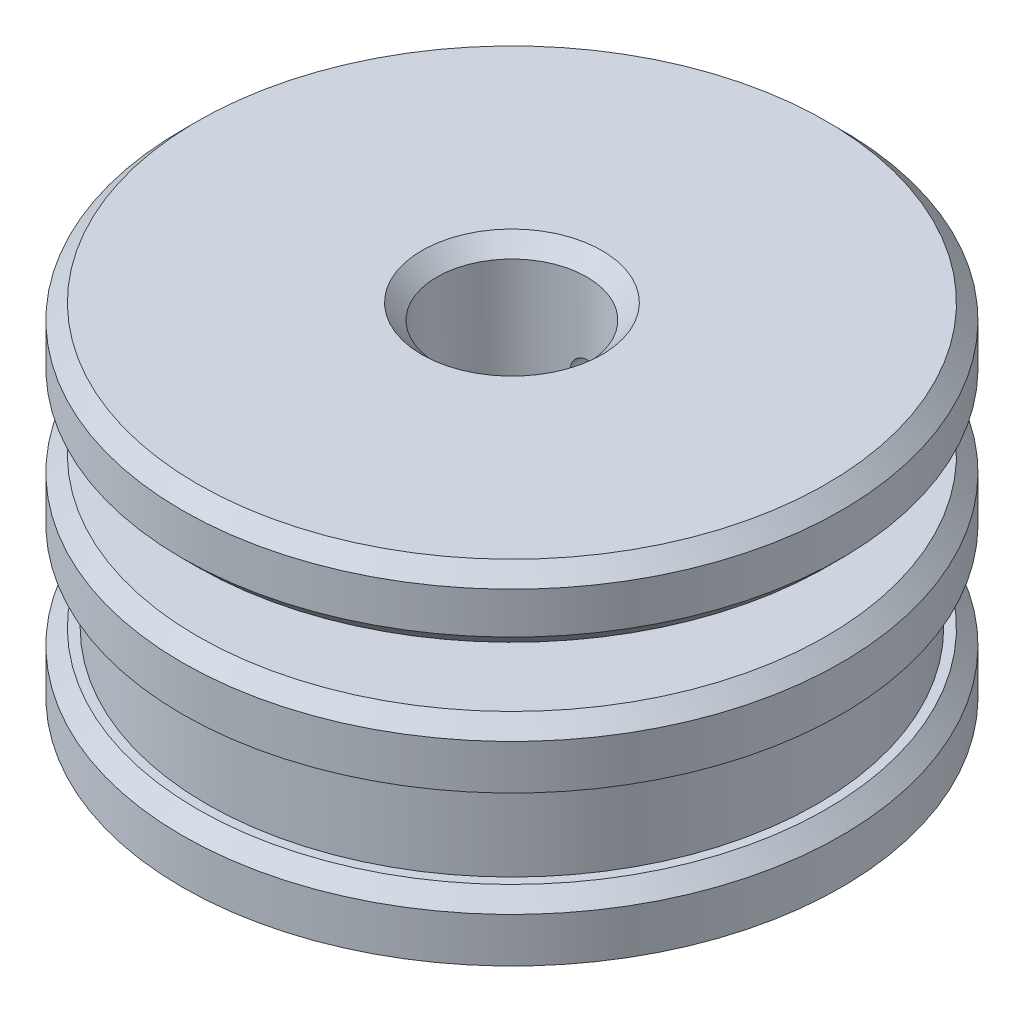
ISO-10303-21;
HEADER;
FILE_DESCRIPTION(('STEP AP214'),'2;1');
FILE_NAME('part.step','',(''),(''),'','','');
FILE_SCHEMA(('AUTOMOTIVE_DESIGN { 1 0 10303 214 1 1 1 1 }'));
ENDSEC;
DATA;
#1=APPLICATION_CONTEXT('core data for automotive mechanical design processes');
#2=APPLICATION_PROTOCOL_DEFINITION('international standard','automotive_design',2000,#1);
#3=PRODUCT_CONTEXT('',#1,'mechanical');
#4=PRODUCT('Part','Part','',(#3));
#5=PRODUCT_RELATED_PRODUCT_CATEGORY('part','',(#4));
#6=PRODUCT_DEFINITION_FORMATION('','',#4);
#7=PRODUCT_DEFINITION_CONTEXT('part definition',#1,'design');
#8=PRODUCT_DEFINITION('design','',#6,#7);
#9=PRODUCT_DEFINITION_SHAPE('','',#8);
#10=(LENGTH_UNIT() NAMED_UNIT(*) SI_UNIT(.MILLI.,.METRE.));
#11=(NAMED_UNIT(*) PLANE_ANGLE_UNIT() SI_UNIT($,.RADIAN.));
#12=(NAMED_UNIT(*) SI_UNIT($,.STERADIAN.) SOLID_ANGLE_UNIT());
#13=UNCERTAINTY_MEASURE_WITH_UNIT(LENGTH_MEASURE(1.E-05),#10,'distance_accuracy_value','');
#14=(GEOMETRIC_REPRESENTATION_CONTEXT(3) GLOBAL_UNCERTAINTY_ASSIGNED_CONTEXT((#13)) GLOBAL_UNIT_ASSIGNED_CONTEXT((#10,
#11,#12)) REPRESENTATION_CONTEXT('',''));
#15=CARTESIAN_POINT('',(0.,0.,0.));
#16=DIRECTION('',(0.,0.,1.));
#17=DIRECTION('',(1.,0.,0.));
#18=AXIS2_PLACEMENT_3D('',#15,#16,#17);
#19=CARTESIAN_POINT('',(0.,7.,0.));
#20=DIRECTION('',(0.,1.,0.));
#21=DIRECTION('',(0.,0.,1.));
#22=AXIS2_PLACEMENT_3D('',#19,#20,#21);
#23=PLANE('',#22);
#24=CARTESIAN_POINT('',(0.,7.,0.));
#25=DIRECTION('',(0.,1.,0.));
#26=DIRECTION('',(0.,0.,1.));
#27=AXIS2_PLACEMENT_3D('',#24,#25,#26);
#28=CIRCLE('',#27,10.492);
#29=CARTESIAN_POINT('',(0.,7.,10.492));
#30=VERTEX_POINT('',#29);
#31=EDGE_CURVE('E227',#30,#30,#28,.T.);
#32=ORIENTED_EDGE('',*,*,#31,.T.);
#33=EDGE_LOOP('',(#32));
#34=FACE_BOUND('',#33,.T.);
#35=CARTESIAN_POINT('',(0.,7.,0.));
#36=DIRECTION('',(0.,1.,0.));
#37=DIRECTION('',(0.,0.,1.));
#38=AXIS2_PLACEMENT_3D('',#35,#36,#37);
#39=CIRCLE('',#38,6.4);
#40=CARTESIAN_POINT('',(0.,7.,6.4));
#41=VERTEX_POINT('',#40);
#42=EDGE_CURVE('E64',#41,#41,#39,.T.);
#43=ORIENTED_EDGE('',*,*,#42,.F.);
#44=EDGE_LOOP('',(#43));
#45=FACE_BOUND('',#44,.T.);
#46=ADVANCED_FACE('F39',(#34,#45),#23,.T.);
#47=CARTESIAN_POINT('',(0.,3.5,0.));
#48=DIRECTION('',(0.,1.,0.));
#49=DIRECTION('',(0.,0.,1.));
#50=AXIS2_PLACEMENT_3D('',#47,#48,#49);
#51=PLANE('',#50);
#52=CARTESIAN_POINT('',(0.,3.5,0.));
#53=DIRECTION('',(0.,1.,0.));
#54=DIRECTION('',(0.,0.,1.));
#55=AXIS2_PLACEMENT_3D('',#52,#53,#54);
#56=CIRCLE('',#55,1.1375);
#57=CARTESIAN_POINT('',(0.,3.5,1.1375));
#58=VERTEX_POINT('',#57);
#59=EDGE_CURVE('E195',#58,#58,#56,.T.);
#60=ORIENTED_EDGE('',*,*,#59,.F.);
#61=EDGE_LOOP('',(#60));
#62=FACE_BOUND('',#61,.T.);
#63=CARTESIAN_POINT('',(0.,3.5,0.));
#64=DIRECTION('',(0.,1.,0.));
#65=DIRECTION('',(0.,0.,1.));
#66=AXIS2_PLACEMENT_3D('',#63,#64,#65);
#67=CIRCLE('',#66,2.5);
#68=CARTESIAN_POINT('',(0.,3.5,-2.5));
#69=VERTEX_POINT('',#68);
#70=EDGE_CURVE('E183',#69,#69,#67,.T.);
#71=ORIENTED_EDGE('',*,*,#70,.T.);
#72=EDGE_LOOP('',(#71));
#73=FACE_BOUND('',#72,.T.);
#74=ADVANCED_FACE('F123',(#62,#73),#51,.T.);
#75=CARTESIAN_POINT('',(0.,2.,0.));
#76=DIRECTION('',(0.,1.,0.));
#77=DIRECTION('',(0.,0.,1.));
#78=AXIS2_PLACEMENT_3D('',#75,#76,#77);
#79=PLANE('',#78);
#80=CARTESIAN_POINT('',(0.,2.,0.));
#81=DIRECTION('',(0.,1.,0.));
#82=DIRECTION('',(0.,0.,1.));
#83=AXIS2_PLACEMENT_3D('',#80,#81,#82);
#84=CIRCLE('',#83,10.492);
#85=CARTESIAN_POINT('',(0.,2.,10.492));
#86=VERTEX_POINT('',#85);
#87=EDGE_CURVE('E82',#86,#86,#84,.T.);
#88=ORIENTED_EDGE('',*,*,#87,.T.);
#89=EDGE_LOOP('',(#88));
#90=FACE_BOUND('',#89,.T.);
#91=CARTESIAN_POINT('',(0.,2.,0.));
#92=DIRECTION('',(0.,1.,0.));
#93=DIRECTION('',(0.,0.,1.));
#94=AXIS2_PLACEMENT_3D('',#91,#92,#93);
#95=CIRCLE('',#94,10.19);
#96=CARTESIAN_POINT('',(0.,2.,10.19));
#97=VERTEX_POINT('',#96);
#98=EDGE_CURVE('E203',#97,#97,#95,.T.);
#99=ORIENTED_EDGE('',*,*,#98,.F.);
#100=EDGE_LOOP('',(#99));
#101=FACE_BOUND('',#100,.T.);
#102=ADVANCED_FACE('F119',(#90,#101),#79,.T.);
#103=CARTESIAN_POINT('',(0.,0.,0.));
#104=DIRECTION('',(0.,1.,0.));
#105=DIRECTION('',(0.,0.,1.));
#106=AXIS2_PLACEMENT_3D('',#103,#104,#105);
#107=PLANE('',#106);
#108=CARTESIAN_POINT('',(0.,0.,0.));
#109=DIRECTION('',(0.,1.,0.));
#110=DIRECTION('',(0.,0.,1.));
#111=AXIS2_PLACEMENT_3D('',#108,#109,#110);
#112=CIRCLE('',#111,11.);
#113=CARTESIAN_POINT('',(0.,0.,11.));
#114=VERTEX_POINT('',#113);
#115=EDGE_CURVE('E207',#114,#114,#112,.T.);
#116=ORIENTED_EDGE('',*,*,#115,.F.);
#117=EDGE_LOOP('',(#116));
#118=FACE_BOUND('',#117,.T.);
#119=CARTESIAN_POINT('',(0.,0.,0.));
#120=DIRECTION('',(0.,1.,0.));
#121=DIRECTION('',(0.,0.,1.));
#122=AXIS2_PLACEMENT_3D('',#119,#120,#121);
#123=CIRCLE('',#122,2.38125);
#124=CARTESIAN_POINT('',(0.,0.,2.38125));
#125=VERTEX_POINT('',#124);
#126=EDGE_CURVE('E211',#125,#125,#123,.T.);
#127=ORIENTED_EDGE('',*,*,#126,.T.);
#128=EDGE_LOOP('',(#127));
#129=FACE_BOUND('',#128,.T.);
#130=ADVANCED_FACE('F122',(#118,#129),#107,.F.);
#131=CARTESIAN_POINT('',(0.,2.,0.));
#132=DIRECTION('',(0.,-1.,0.));
#133=DIRECTION('',(0.,0.,-1.));
#134=AXIS2_PLACEMENT_3D('',#131,#132,#133);
#135=CYLINDRICAL_SURFACE('',#134,11.);
#136=CARTESIAN_POINT('',(0.,1.492,0.));
#137=DIRECTION('',(0.,1.,0.));
#138=DIRECTION('',(0.,0.,1.));
#139=AXIS2_PLACEMENT_3D('',#136,#137,#138);
#140=CIRCLE('',#139,11.);
#141=CARTESIAN_POINT('',(0.,1.492,11.));
#142=VERTEX_POINT('',#141);
#143=EDGE_CURVE('E224',#142,#142,#140,.F.);
#144=ORIENTED_EDGE('',*,*,#143,.T.);
#145=EDGE_LOOP('',(#144));
#146=FACE_BOUND('',#145,.T.);
#147=ORIENTED_EDGE('',*,*,#115,.T.);
#148=EDGE_LOOP('',(#147));
#149=FACE_BOUND('',#148,.T.);
#150=ADVANCED_FACE('F117',(#146,#149),#135,.T.);
#151=CARTESIAN_POINT('',(0.,2.,0.));
#152=DIRECTION('',(0.,-1.,0.));
#153=DIRECTION('',(0.,0.,-1.));
#154=AXIS2_PLACEMENT_3D('',#151,#152,#153);
#155=CYLINDRICAL_SURFACE('',#154,2.38125);
#156=CARTESIAN_POINT('',(0.,2.,0.));
#157=DIRECTION('',(0.,1.,0.));
#158=DIRECTION('',(0.,0.,1.));
#159=AXIS2_PLACEMENT_3D('',#156,#157,#158);
#160=CIRCLE('',#159,2.38125);
#161=CARTESIAN_POINT('',(0.,2.,2.38125));
#162=VERTEX_POINT('',#161);
#163=EDGE_CURVE('E199',#162,#162,#160,.T.);
#164=ORIENTED_EDGE('',*,*,#163,.T.);
#165=EDGE_LOOP('',(#164));
#166=FACE_BOUND('',#165,.T.);
#167=ORIENTED_EDGE('',*,*,#126,.F.);
#168=EDGE_LOOP('',(#167));
#169=FACE_BOUND('',#168,.T.);
#170=ADVANCED_FACE('F114',(#166,#169),#155,.F.);
#171=CARTESIAN_POINT('',(0.,2.,0.));
#172=DIRECTION('',(0.,1.,0.));
#173=DIRECTION('',(0.,0.,1.));
#174=AXIS2_PLACEMENT_3D('',#171,#172,#173);
#175=PLANE('',#174);
#176=ORIENTED_EDGE('',*,*,#163,.F.);
#177=EDGE_LOOP('',(#176));
#178=FACE_BOUND('',#177,.T.);
#179=CARTESIAN_POINT('',(0.,2.,0.));
#180=DIRECTION('',(0.,1.,0.));
#181=DIRECTION('',(0.,0.,1.));
#182=AXIS2_PLACEMENT_3D('',#179,#180,#181);
#183=CIRCLE('',#182,1.1375);
#184=CARTESIAN_POINT('',(0.,2.,1.1375));
#185=VERTEX_POINT('',#184);
#186=EDGE_CURVE('E194',#185,#185,#183,.T.);
#187=ORIENTED_EDGE('',*,*,#186,.T.);
#188=EDGE_LOOP('',(#187));
#189=FACE_BOUND('',#188,.T.);
#190=ADVANCED_FACE('F111',(#178,#189),#175,.F.);
#191=CARTESIAN_POINT('',(0.,3.5,0.));
#192=DIRECTION('',(0.,-1.,0.));
#193=DIRECTION('',(0.,0.,-1.));
#194=AXIS2_PLACEMENT_3D('',#191,#192,#193);
#195=CYLINDRICAL_SURFACE('',#194,10.19);
#196=CARTESIAN_POINT('',(0.,4.5,-10.19));
#197=CARTESIAN_POINT('',(-0.0280670986840343,4.49999876108072,-10.1899998358154));
#198=CARTESIAN_POINT('',(-0.0561541182214318,4.49762877683952,-10.1898827968926));
#199=CARTESIAN_POINT('',(-0.111553383651336,4.48820802349842,-10.1894271570571));
#200=CARTESIAN_POINT('',(-0.138864676307793,4.48115173495723,-10.1890882948918));
#201=CARTESIAN_POINT('',(-0.191901955892133,4.46256084606419,-10.1882273633371));
#202=CARTESIAN_POINT('',(-0.21762874118005,4.45102852272531,-10.187705387113));
#203=CARTESIAN_POINT('',(-0.266774338330808,4.4238164101285,-10.1865370198126));
#204=CARTESIAN_POINT('',(-0.290193694292934,4.40813760185319,-10.1858906581735));
#205=CARTESIAN_POINT('',(-0.334089537190813,4.37306048275076,-10.1845455288287));
#206=CARTESIAN_POINT('',(-0.354563490848312,4.35365900320426,-10.1838467167882));
#207=CARTESIAN_POINT('',(-0.391965769262595,4.31169358287383,-10.1824758296322));
#208=CARTESIAN_POINT('',(-0.408893949394596,4.289129513157,-10.1818037556083));
#209=CARTESIAN_POINT('',(-0.438731054244269,4.24146624010713,-10.1805618204759));
#210=CARTESIAN_POINT('',(-0.451638013222815,4.21636580480863,-10.1799920094153));
#211=CARTESIAN_POINT('',(-0.473053679327432,4.16435098458832,-10.1790193927782));
#212=CARTESIAN_POINT('',(-0.481562418918969,4.13743661305775,-10.1786165859689));
#213=CARTESIAN_POINT('',(-0.493933455468684,4.08258111253898,-10.178023799871));
#214=CARTESIAN_POINT('',(-0.497799524670376,4.05464083616573,-10.1778336478057));
#215=CARTESIAN_POINT('',(-0.500787115044941,3.99850728686996,-10.1776870953315));
#216=CARTESIAN_POINT('',(-0.499908672590498,3.97031401588861,-10.1777306931307));
#217=CARTESIAN_POINT('',(-0.493435319133262,3.91450041782835,-10.1780465633269));
#218=CARTESIAN_POINT('',(-0.487844483715351,3.88687961678315,-10.1783186381212));
#219=CARTESIAN_POINT('',(-0.472111362967402,3.8329690447948,-10.1790604852713));
#220=CARTESIAN_POINT('',(-0.46196905893452,3.80667927932161,-10.1795302584393));
#221=CARTESIAN_POINT('',(-0.437416247742381,3.75616391781772,-10.1806147820437));
#222=CARTESIAN_POINT('',(-0.423003881890716,3.73193922660756,-10.18122959559));
#223=CARTESIAN_POINT('',(-0.390321416291483,3.68625156124726,-10.1825348393098));
#224=CARTESIAN_POINT('',(-0.372051290380474,3.66478860582889,-10.1832252699961));
#225=CARTESIAN_POINT('',(-0.332148924203436,3.62520994442324,-10.1846048072655));
#226=CARTESIAN_POINT('',(-0.310513154409286,3.60709779656432,-10.1852939116808));
#227=CARTESIAN_POINT('',(-0.264506067297044,3.57476230423246,-10.1865924245192));
#228=CARTESIAN_POINT('',(-0.240134749321989,3.56053896069344,-10.1872018329231));
#229=CARTESIAN_POINT('',(-0.189346302419535,3.536385169739,-10.1882722971715));
#230=CARTESIAN_POINT('',(-0.162929114683232,3.52645484578126,-10.1887333487494));
#231=CARTESIAN_POINT('',(-0.108799736560071,3.51117130201671,-10.1894550749427));
#232=CARTESIAN_POINT('',(-0.0810875555130332,3.50581804920427,-10.189715751003));
#233=CARTESIAN_POINT('',(-0.0251857288290913,3.49984499086512,-10.190007161497));
#234=CARTESIAN_POINT('',(0.00300338974334651,3.49922026368574,-10.1900381350145));
#235=CARTESIAN_POINT('',(0.0590860596345895,3.50270914749002,-10.1898672843019));
#236=CARTESIAN_POINT('',(0.0869796118939022,3.50682274339151,-10.1896654608129));
#237=CARTESIAN_POINT('',(0.141665566458615,3.51966742995357,-10.1890519027055));
#238=CARTESIAN_POINT('',(0.168458497666373,3.52839627411224,-10.1886402702165));
#239=CARTESIAN_POINT('',(0.220198946798632,3.55022139978092,-10.187653440639));
#240=CARTESIAN_POINT('',(0.245146454495286,3.56331770549439,-10.187078242644));
#241=CARTESIAN_POINT('',(0.292510490229523,3.59351860320557,-10.1858283985692));
#242=CARTESIAN_POINT('',(0.314924911930208,3.61062649513881,-10.1851536707864));
#243=CARTESIAN_POINT('',(0.356565335290441,3.64836011234546,-10.1837810300863));
#244=CARTESIAN_POINT('',(0.375791317207803,3.66898585939913,-10.1830831170255));
#245=CARTESIAN_POINT('',(0.410525668052513,3.71319086550568,-10.1817420872451));
#246=CARTESIAN_POINT('',(0.42603085317218,3.7367726278812,-10.1810990177552));
#247=CARTESIAN_POINT('',(0.452861715279855,3.78620761034801,-10.1799409324545));
#248=CARTESIAN_POINT('',(0.464187409955031,3.8120608208262,-10.1794259161018));
#249=CARTESIAN_POINT('',(0.482332242868642,3.86529301542234,-10.178582349598));
#250=CARTESIAN_POINT('',(0.489153412506777,3.8926713057284,-10.1782537154038));
#251=CARTESIAN_POINT('',(0.498102212118212,3.94818620577011,-10.1778197353607));
#252=CARTESIAN_POINT('',(0.500229867434098,3.9763228114104,-10.1777143883061));
#253=CARTESIAN_POINT('',(0.499730999639772,4.03252394974312,-10.1777388924337));
#254=CARTESIAN_POINT('',(0.497109485565242,4.06058852714437,-10.1778684958095));
#255=CARTESIAN_POINT('',(0.487197046041719,4.11587861380795,-10.1783477698156));
#256=CARTESIAN_POINT('',(0.479906111668791,4.14310412146661,-10.1786974408666));
#257=CARTESIAN_POINT('',(0.460862807976032,4.19594431140184,-10.1795773838778));
#258=CARTESIAN_POINT('',(0.449110402579337,4.22155898065071,-10.1801076572984));
#259=CARTESIAN_POINT('',(0.421478648417677,4.27045189756754,-10.1812890213593));
#260=CARTESIAN_POINT('',(0.405599427578255,4.29373021762807,-10.1819401082543));
#261=CARTESIAN_POINT('',(0.370146927074556,4.33731462548509,-10.1832904966726));
#262=CARTESIAN_POINT('',(0.350570169925274,4.35761788309191,-10.1839898431874));
#263=CARTESIAN_POINT('',(0.308280327266235,4.39465601804831,-10.1853576186704));
#264=CARTESIAN_POINT('',(0.285566471086763,4.41139001598416,-10.1860260399875));
#265=CARTESIAN_POINT('',(0.237629886220107,4.4408221483539,-10.1872570918863));
#266=CARTESIAN_POINT('',(0.212404819125307,4.45351647406331,-10.1878196224282));
#267=CARTESIAN_POINT('',(0.160197558971177,4.47447462016467,-10.18877399561));
#268=CARTESIAN_POINT('',(0.133217485048764,4.48274367656337,-10.1891660398669));
#269=CARTESIAN_POINT('',(0.088391349463175,4.49244626951435,-10.1896315074521));
#270=CARTESIAN_POINT('',(0.0708356710894922,4.49527530504146,-10.1897690853145));
#271=CARTESIAN_POINT('',(0.0355226553765816,4.49905256160582,-10.1899533835123));
#272=CARTESIAN_POINT('',(0.0177653182026807,4.50000078418491,-10.1900001039221));
#273=CARTESIAN_POINT('',(0.,4.5,-10.19));
#274=B_SPLINE_CURVE_WITH_KNOTS('',3,(#196,#197,#198,#199,#200,#201,#202,#203,#204,#205,#206,
#207,#208,#209,#210,#211,#212,#213,#214,#215,#216,#217,#218,#219,#220,#221,#222,#223,#224,#225,
#226,#227,#228,#229,#230,#231,#232,#233,#234,#235,#236,#237,#238,#239,#240,#241,#242,#243,#244,
#245,#246,#247,#248,#249,#250,#251,#252,#253,#254,#255,#256,#257,#258,#259,#260,#261,#262,#263,
#264,#265,#266,#267,#268,#269,#270,#271,#272,#273),.UNSPECIFIED.,.T.,.F.,(4,2,2,2,2,2,2,2,2,2,2,
2,2,2,2,2,2,2,2,2,2,2,2,2,2,2,2,2,2,2,2,2,2,2,2,2,2,2,4),(0.,0.084136446264515,
0.168372163010103,0.252565084075257,0.33673810442365,0.420983092848381,0.505231516783462,
0.589521060444585,0.673809981913378,0.758030370854733,0.842250114141184,0.926397093349085,
1.01054441833597,1.09472842531086,1.17891300324247,1.26318646765238,1.34745995230125,
1.4317358603068,1.5160111605869,1.6001987314346,1.68438603431253,1.76853239615125,
1.85267922431736,1.93689551610568,2.02111232932508,2.10540095017742,2.18968921432502,
2.27393944110039,2.35818921296637,2.4423501767878,2.52651130145343,2.61067310668697,
2.69483230333263,2.7790710483339,2.86333052462436,2.9476692095177,3.03190788246832,
3.08516283348717,3.13841774084894),.UNSPECIFIED.);
#275=CARTESIAN_POINT('',(0.,4.5,-10.19));
#276=VERTEX_POINT('',#275);
#277=EDGE_CURVE('E58',#276,#276,#274,.T.);
#278=ORIENTED_EDGE('',*,*,#277,.T.);
#279=EDGE_LOOP('',(#278));
#280=FACE_BOUND('',#279,.T.);
#281=ORIENTED_EDGE('',*,*,#98,.T.);
#282=EDGE_LOOP('',(#281));
#283=FACE_BOUND('',#282,.T.);
#284=CARTESIAN_POINT('',(0.,5.,0.));
#285=DIRECTION('',(0.,1.,0.));
#286=DIRECTION('',(0.,0.,1.));
#287=AXIS2_PLACEMENT_3D('',#284,#285,#286);
#288=CIRCLE('',#287,10.19);
#289=CARTESIAN_POINT('',(0.,5.,10.19));
#290=VERTEX_POINT('',#289);
#291=EDGE_CURVE('E187',#290,#290,#288,.T.);
#292=ORIENTED_EDGE('',*,*,#291,.F.);
#293=EDGE_LOOP('',(#292));
#294=FACE_BOUND('',#293,.T.);
#295=ADVANCED_FACE('F105',(#280,#283,#294),#195,.T.);
#296=CARTESIAN_POINT('',(0.,3.5,0.));
#297=DIRECTION('',(0.,-1.,0.));
#298=DIRECTION('',(0.,0.,-1.));
#299=AXIS2_PLACEMENT_3D('',#296,#297,#298);
#300=CYLINDRICAL_SURFACE('',#299,1.1375);
#301=ORIENTED_EDGE('',*,*,#59,.T.);
#302=EDGE_LOOP('',(#301));
#303=FACE_BOUND('',#302,.T.);
#304=ORIENTED_EDGE('',*,*,#186,.F.);
#305=EDGE_LOOP('',(#304));
#306=FACE_BOUND('',#305,.T.);
#307=ADVANCED_FACE('F110',(#303,#306),#300,.F.);
#308=CARTESIAN_POINT('',(0.,5.,0.));
#309=DIRECTION('',(0.,-1.,0.));
#310=DIRECTION('',(0.,0.,-1.));
#311=AXIS2_PLACEMENT_3D('',#308,#309,#310);
#312=CYLINDRICAL_SURFACE('',#311,2.5);
#313=CARTESIAN_POINT('',(0.,10.892,0.));
#314=DIRECTION('',(0.,1.,0.));
#315=DIRECTION('',(0.,0.,1.));
#316=AXIS2_PLACEMENT_3D('',#313,#314,#315);
#317=CIRCLE('',#316,2.5);
#318=CARTESIAN_POINT('',(0.,10.892,2.5));
#319=VERTEX_POINT('',#318);
#320=EDGE_CURVE('E11',#319,#319,#317,.T.);
#321=ORIENTED_EDGE('',*,*,#320,.T.);
#322=EDGE_LOOP('',(#321));
#323=FACE_BOUND('',#322,.T.);
#324=CARTESIAN_POINT('',(0.,8.5,-2.5));
#325=CARTESIAN_POINT('',(-0.0277884533963166,8.49999897775083,-2.49999948790436));
#326=CARTESIAN_POINT('',(-0.0555898301007612,8.49767557851618,-2.49953192589115));
#327=CARTESIAN_POINT('',(-0.11040675384451,8.48845074994238,-2.49771182811616));
#328=CARTESIAN_POINT('',(-0.137421658770678,8.48154568359925,-2.49635858930093));
#329=CARTESIAN_POINT('',(-0.189865152631656,8.4633793631896,-2.49291824639143));
#330=CARTESIAN_POINT('',(-0.215295233966567,8.45212228157766,-2.49083184538359));
#331=CARTESIAN_POINT('',(-0.263903994432113,8.42558387624435,-2.48615199017657));
#332=CARTESIAN_POINT('',(-0.287082807537906,8.4103027921964,-2.48355856617854));
#333=CARTESIAN_POINT('',(-0.330846738657433,8.37593075285428,-2.47811082664985));
#334=CARTESIAN_POINT('',(-0.351396975579263,8.3567958223044,-2.47525372752174));
#335=CARTESIAN_POINT('',(-0.389018378304015,8.31535379180415,-2.46962090226294));
#336=CARTESIAN_POINT('',(-0.406089272385213,8.29304644433244,-2.46684518250212));
#337=CARTESIAN_POINT('',(-0.436415876673811,8.24564190349406,-2.46166220906308));
#338=CARTESIAN_POINT('',(-0.449635469432934,8.22052117810182,-2.45925853682473));
#339=CARTESIAN_POINT('',(-0.471652833290155,8.16835909049796,-2.45513134029209));
#340=CARTESIAN_POINT('',(-0.48045104121862,8.14131791832683,-2.45340774880981));
#341=CARTESIAN_POINT('',(-0.493262649942414,8.08645781804604,-2.45086402626102));
#342=CARTESIAN_POINT('',(-0.497337248979389,8.05865372792889,-2.45003235053594));
#343=CARTESIAN_POINT('',(-0.50077606386306,8.00274508931783,-2.44933187530314));
#344=CARTESIAN_POINT('',(-0.500140761356751,7.97464057183993,-2.4494629773392));
#345=CARTESIAN_POINT('',(-0.49422728655091,7.9193766059895,-2.45066275574092));
#346=CARTESIAN_POINT('',(-0.489019270121953,7.89220929718634,-2.45171726429382));
#347=CARTESIAN_POINT('',(-0.474218942311526,7.8391419616685,-2.45462273080001));
#348=CARTESIAN_POINT('',(-0.464626421550341,7.8132419955405,-2.45647372678889));
#349=CARTESIAN_POINT('',(-0.44126239183736,7.7632423691482,-2.46077809250204));
#350=CARTESIAN_POINT('',(-0.427463075616058,7.73915606021541,-2.46323544906852));
#351=CARTESIAN_POINT('',(-0.39609678728634,7.69361457501359,-2.46847309386531));
#352=CARTESIAN_POINT('',(-0.378529382178415,7.67215970157442,-2.47125341919183));
#353=CARTESIAN_POINT('',(-0.339749967280292,7.63208529877153,-2.47688510620731));
#354=CARTESIAN_POINT('',(-0.318478080606222,7.61352371607043,-2.47973684605452));
#355=CARTESIAN_POINT('',(-0.273092512031005,7.58022307684939,-2.48514424357204));
#356=CARTESIAN_POINT('',(-0.248978793689695,7.56548406935321,-2.48769989744487));
#357=CARTESIAN_POINT('',(-0.198529693439461,7.54023624538701,-2.49223345080444));
#358=CARTESIAN_POINT('',(-0.17219090979265,7.52973405317773,-2.49421044424136));
#359=CARTESIAN_POINT('',(-0.118074488224332,7.51331976298072,-2.49735704493929));
#360=CARTESIAN_POINT('',(-0.0902970250362247,7.50740710896319,-2.49852675000266));
#361=CARTESIAN_POINT('',(-0.034589702813575,7.50042177310286,-2.49991335933434));
#362=CARTESIAN_POINT('',(-0.00667016416278788,7.49926979022987,-2.50014587326235));
#363=CARTESIAN_POINT('',(0.0489624670963572,7.50162492947109,-2.49967525965051));
#364=CARTESIAN_POINT('',(0.0766755712218968,7.5051317896763,-2.49897218470723));
#365=CARTESIAN_POINT('',(0.130852829973271,7.51663918677198,-2.49671916004009));
#366=CARTESIAN_POINT('',(0.157325974169952,7.52459903424895,-2.49517688202103));
#367=CARTESIAN_POINT('',(0.208561813749834,7.5447419913279,-2.49141776030516));
#368=CARTESIAN_POINT('',(0.23332438081877,7.55692541733842,-2.48920086607113));
#369=CARTESIAN_POINT('',(0.280770586843109,7.58534124532566,-2.48429955766647));
#370=CARTESIAN_POINT('',(0.303425063376095,7.60162139051947,-2.48160975218526));
#371=CARTESIAN_POINT('',(0.345709009559604,7.63770459560364,-2.47607367414941));
#372=CARTESIAN_POINT('',(0.365338154465382,7.65750803319993,-2.47322738484194));
#373=CARTESIAN_POINT('',(0.401320295387089,7.70043667594556,-2.46764651778482));
#374=CARTESIAN_POINT('',(0.417618851224329,7.72360787211067,-2.46491430116652));
#375=CARTESIAN_POINT('',(0.446092710025604,7.77240568067834,-2.45992095898097));
#376=CARTESIAN_POINT('',(0.458268177961452,7.79803219478678,-2.45765981456671));
#377=CARTESIAN_POINT('',(0.478075920790981,7.85088412307478,-2.45388370292191));
#378=CARTESIAN_POINT('',(0.485731749895526,7.87810042060516,-2.45236487436093));
#379=CARTESIAN_POINT('',(0.496354325813599,7.93346672674545,-2.45023718396013));
#380=CARTESIAN_POINT('',(0.499321684112557,7.96161661310468,-2.44962820345556));
#381=CARTESIAN_POINT('',(0.500460455433734,8.01750443227216,-2.4493957481569));
#382=CARTESIAN_POINT('',(0.498717894035448,8.04524057446351,-2.4497545959465));
#383=CARTESIAN_POINT('',(0.49067615205003,8.10001582495252,-2.45137786742307));
#384=CARTESIAN_POINT('',(0.484377008064649,8.1270549388474,-2.45264228383585));
#385=CARTESIAN_POINT('',(0.467439284249477,8.17961385562027,-2.45592632109579));
#386=CARTESIAN_POINT('',(0.456811253358672,8.20513718025121,-2.45794410509415));
#387=CARTESIAN_POINT('',(0.431527322300801,8.25405186036722,-2.46250857487085));
#388=CARTESIAN_POINT('',(0.416871084387441,8.27744303686257,-2.46505530499447));
#389=CARTESIAN_POINT('',(0.383652957393207,8.32185778607516,-2.47044480261613));
#390=CARTESIAN_POINT('',(0.36502894361759,8.3428343826338,-2.4732918645485));
#391=CARTESIAN_POINT('',(0.32453218450657,8.38139310276459,-2.47893040935977));
#392=CARTESIAN_POINT('',(0.302658693576667,8.39897444515864,-2.48172187931592));
#393=CARTESIAN_POINT('',(0.256008814544123,8.43041732197323,-2.48696916193986));
#394=CARTESIAN_POINT('',(0.231204442214917,8.44423800164001,-2.48942115609623));
#395=CARTESIAN_POINT('',(0.179583180470366,8.4674930612983,-2.493675625425));
#396=CARTESIAN_POINT('',(0.152768130431563,8.47693139476625,-2.49547868569308));
#397=CARTESIAN_POINT('',(0.10491074446189,8.48932597402236,-2.49788186297685));
#398=CARTESIAN_POINT('',(0.0841408320068922,8.49332159685388,-2.49867151579226));
#399=CARTESIAN_POINT('',(0.0422497626050334,8.49865895617918,-2.49973077069946));
#400=CARTESIAN_POINT('',(0.0211286168743095,8.50000077725488,-2.50000038936577));
#401=CARTESIAN_POINT('',(0.,8.5,-2.5));
#402=B_SPLINE_CURVE_WITH_KNOTS('',3,(#324,#325,#326,#327,#328,#329,#330,#331,#332,#333,#334,
#335,#336,#337,#338,#339,#340,#341,#342,#343,#344,#345,#346,#347,#348,#349,#350,#351,#352,#353,
#354,#355,#356,#357,#358,#359,#360,#361,#362,#363,#364,#365,#366,#367,#368,#369,#370,#371,#372,
#373,#374,#375,#376,#377,#378,#379,#380,#381,#382,#383,#384,#385,#386,#387,#388,#389,#390,#391,
#392,#393,#394,#395,#396,#397,#398,#399,#400,#401),.UNSPECIFIED.,.T.,.F.,(4,2,2,2,2,2,2,2,2,2,2,
2,2,2,2,2,2,2,2,2,2,2,2,2,2,2,2,2,2,2,2,2,2,2,2,2,2,2,4),(0.,0.0832880653306292,
0.166642325345662,0.249916867625171,0.333186451115432,0.417466335056093,0.501752798373684,
0.586805975029615,0.671850746825989,0.755780925517938,0.839702521406128,0.922358635031393,
1.00501869626865,1.08823745101796,1.17146577374835,1.25619126245676,1.3409178376991,
1.42577637427012,1.51062462849018,1.59405367838133,1.67747803828934,1.76015226975362,
1.84283269608011,1.9265253301668,2.01022694172965,2.09520314289613,2.18017594361734,
2.26470190516362,2.34921684165208,2.43219861283851,2.51517971746305,2.59795980626556,
2.68074683790934,2.76494038119572,2.84915327266466,2.93424748337819,3.0192647775876,
3.08259387644947,3.14592095685498),.UNSPECIFIED.);
#403=CARTESIAN_POINT('',(0.,8.5,-2.5));
#404=VERTEX_POINT('',#403);
#405=EDGE_CURVE('E59',#404,#404,#402,.T.);
#406=ORIENTED_EDGE('',*,*,#405,.F.);
#407=EDGE_LOOP('',(#406));
#408=FACE_BOUND('',#407,.T.);
#409=ORIENTED_EDGE('',*,*,#70,.F.);
#410=CARTESIAN_POINT('',(0.,4.5,-2.5));
#411=CARTESIAN_POINT('',(-0.0277884533963166,4.49999897775083,-2.49999948790436));
#412=CARTESIAN_POINT('',(-0.0555898301007611,4.49767557851618,-2.49953192589115));
#413=CARTESIAN_POINT('',(-0.11040675384451,4.48845074994238,-2.49771182811616));
#414=CARTESIAN_POINT('',(-0.137421658770678,4.48154568359925,-2.49635858930093));
#415=CARTESIAN_POINT('',(-0.189865152631657,4.46337936318961,-2.49291824639143));
#416=CARTESIAN_POINT('',(-0.215295233966567,4.45212228157766,-2.49083184538359));
#417=CARTESIAN_POINT('',(-0.263903994432113,4.42558387624435,-2.48615199017657));
#418=CARTESIAN_POINT('',(-0.287082807537906,4.4103027921964,-2.48355856617854));
#419=CARTESIAN_POINT('',(-0.330846738657432,4.37593075285428,-2.47811082664985));
#420=CARTESIAN_POINT('',(-0.351396975579262,4.3567958223044,-2.47525372752174));
#421=CARTESIAN_POINT('',(-0.389018378304014,4.31535379180415,-2.46962090226294));
#422=CARTESIAN_POINT('',(-0.406089272385212,4.29304644433244,-2.46684518250212));
#423=CARTESIAN_POINT('',(-0.43641587667381,4.24564190349406,-2.46166220906308));
#424=CARTESIAN_POINT('',(-0.449635469432933,4.22052117810182,-2.45925853682473));
#425=CARTESIAN_POINT('',(-0.471652833290154,4.16835909049796,-2.45513134029209));
#426=CARTESIAN_POINT('',(-0.480451041218619,4.14131791832683,-2.45340774880981));
#427=CARTESIAN_POINT('',(-0.493262649942414,4.08645781804604,-2.45086402626102));
#428=CARTESIAN_POINT('',(-0.497337248979389,4.05865372792889,-2.45003235053594));
#429=CARTESIAN_POINT('',(-0.50077606386306,4.00274508931783,-2.44933187530314));
#430=CARTESIAN_POINT('',(-0.50014076135675,3.97464057183993,-2.4494629773392));
#431=CARTESIAN_POINT('',(-0.494227286550909,3.9193766059895,-2.45066275574092));
#432=CARTESIAN_POINT('',(-0.489019270121953,3.89220929718634,-2.45171726429382));
#433=CARTESIAN_POINT('',(-0.474218942311525,3.8391419616685,-2.45462273080001));
#434=CARTESIAN_POINT('',(-0.46462642155034,3.8132419955405,-2.45647372678889));
#435=CARTESIAN_POINT('',(-0.44126239183736,3.7632423691482,-2.46077809250204));
#436=CARTESIAN_POINT('',(-0.427463075616057,3.73915606021541,-2.46323544906852));
#437=CARTESIAN_POINT('',(-0.396096787286339,3.69361457501359,-2.46847309386531));
#438=CARTESIAN_POINT('',(-0.378529382178414,3.67215970157442,-2.47125341919183));
#439=CARTESIAN_POINT('',(-0.339749967280292,3.63208529877153,-2.47688510620731));
#440=CARTESIAN_POINT('',(-0.318478080606222,3.61352371607043,-2.47973684605452));
#441=CARTESIAN_POINT('',(-0.273092512031005,3.58022307684939,-2.48514424357204));
#442=CARTESIAN_POINT('',(-0.248978793689694,3.56548406935321,-2.48769989744487));
#443=CARTESIAN_POINT('',(-0.19852969343946,3.54023624538701,-2.49223345080444));
#444=CARTESIAN_POINT('',(-0.17219090979265,3.52973405317773,-2.49421044424136));
#445=CARTESIAN_POINT('',(-0.118074488224332,3.51331976298072,-2.49735704493929));
#446=CARTESIAN_POINT('',(-0.0902970250362245,3.50740710896319,-2.49852675000266));
#447=CARTESIAN_POINT('',(-0.0345897028135748,3.50042177310286,-2.49991335933434));
#448=CARTESIAN_POINT('',(-0.00667016416278772,3.49926979022987,-2.50014587326235));
#449=CARTESIAN_POINT('',(0.0489624670963573,3.50162492947109,-2.49967525965051));
#450=CARTESIAN_POINT('',(0.0766755712218968,3.5051317896763,-2.49897218470723));
#451=CARTESIAN_POINT('',(0.130852829973271,3.51663918677198,-2.49671916004009));
#452=CARTESIAN_POINT('',(0.157325974169952,3.52459903424895,-2.49517688202103));
#453=CARTESIAN_POINT('',(0.208561813749834,3.5447419913279,-2.49141776030516));
#454=CARTESIAN_POINT('',(0.23332438081877,3.55692541733842,-2.48920086607113));
#455=CARTESIAN_POINT('',(0.280770586843109,3.58534124532566,-2.48429955766647));
#456=CARTESIAN_POINT('',(0.303425063376094,3.60162139051947,-2.48160975218526));
#457=CARTESIAN_POINT('',(0.345709009559603,3.63770459560364,-2.47607367414941));
#458=CARTESIAN_POINT('',(0.365338154465381,3.65750803319993,-2.47322738484194));
#459=CARTESIAN_POINT('',(0.401320295387088,3.70043667594556,-2.46764651778483));
#460=CARTESIAN_POINT('',(0.417618851224327,3.72360787211067,-2.46491430116652));
#461=CARTESIAN_POINT('',(0.446092710025603,3.77240568067834,-2.45992095898097));
#462=CARTESIAN_POINT('',(0.458268177961451,3.79803219478678,-2.45765981456671));
#463=CARTESIAN_POINT('',(0.47807592079098,3.85088412307477,-2.45388370292191));
#464=CARTESIAN_POINT('',(0.485731749895525,3.87810042060516,-2.45236487436093));
#465=CARTESIAN_POINT('',(0.496354325813598,3.93346672674545,-2.45023718396013));
#466=CARTESIAN_POINT('',(0.499321684112556,3.96161661310467,-2.44962820345556));
#467=CARTESIAN_POINT('',(0.500460455433734,4.01750443227216,-2.4493957481569));
#468=CARTESIAN_POINT('',(0.498717894035448,4.0452405744635,-2.4497545959465));
#469=CARTESIAN_POINT('',(0.490676152050031,4.10001582495251,-2.45137786742307));
#470=CARTESIAN_POINT('',(0.484377008064649,4.1270549388474,-2.45264228383585));
#471=CARTESIAN_POINT('',(0.467439284249477,4.17961385562027,-2.45592632109579));
#472=CARTESIAN_POINT('',(0.456811253358672,4.20513718025121,-2.45794410509415));
#473=CARTESIAN_POINT('',(0.431527322300802,4.25405186036722,-2.46250857487085));
#474=CARTESIAN_POINT('',(0.416871084387441,4.27744303686257,-2.46505530499447));
#475=CARTESIAN_POINT('',(0.383652957393207,4.32185778607516,-2.47044480261613));
#476=CARTESIAN_POINT('',(0.36502894361759,4.3428343826338,-2.4732918645485));
#477=CARTESIAN_POINT('',(0.324532184506571,4.38139310276459,-2.47893040935977));
#478=CARTESIAN_POINT('',(0.302658693576668,4.39897444515864,-2.48172187931592));
#479=CARTESIAN_POINT('',(0.256008814544123,4.43041732197322,-2.48696916193986));
#480=CARTESIAN_POINT('',(0.231204442214918,4.44423800164001,-2.48942115609623));
#481=CARTESIAN_POINT('',(0.179583180470367,4.4674930612983,-2.493675625425));
#482=CARTESIAN_POINT('',(0.152768130431563,4.47693139476625,-2.49547868569308));
#483=CARTESIAN_POINT('',(0.10491074446189,4.48932597402236,-2.49788186297685));
#484=CARTESIAN_POINT('',(0.0841408320068926,4.49332159685388,-2.49867151579226));
#485=CARTESIAN_POINT('',(0.0422497626050337,4.49865895617918,-2.49973077069946));
#486=CARTESIAN_POINT('',(0.0211286168743096,4.50000077725488,-2.50000038936577));
#487=CARTESIAN_POINT('',(0.,4.5,-2.5));
#488=B_SPLINE_CURVE_WITH_KNOTS('',3,(#410,#411,#412,#413,#414,#415,#416,#417,#418,#419,#420,
#421,#422,#423,#424,#425,#426,#427,#428,#429,#430,#431,#432,#433,#434,#435,#436,#437,#438,#439,
#440,#441,#442,#443,#444,#445,#446,#447,#448,#449,#450,#451,#452,#453,#454,#455,#456,#457,#458,
#459,#460,#461,#462,#463,#464,#465,#466,#467,#468,#469,#470,#471,#472,#473,#474,#475,#476,#477,
#478,#479,#480,#481,#482,#483,#484,#485,#486,#487),.UNSPECIFIED.,.T.,.F.,(4,2,2,2,2,2,2,2,2,2,2,
2,2,2,2,2,2,2,2,2,2,2,2,2,2,2,2,2,2,2,2,2,2,2,2,2,2,2,4),(0.,0.0832880653306292,
0.166642325345662,0.249916867625171,0.333186451115432,0.417466335056093,0.501752798373683,
0.586805975029613,0.671850746825988,0.755780925517937,0.839702521406126,0.922358635031392,
1.00501869626865,1.08823745101796,1.17146577374835,1.25619126245675,1.3409178376991,
1.42577637427012,1.51062462849018,1.59405367838133,1.67747803828934,1.76015226975362,
1.84283269608011,1.92652533016679,2.01022694172965,2.09520314289613,2.18017594361733,
2.26470190516362,2.34921684165207,2.43219861283851,2.51517971746304,2.59795980626555,
2.68074683790933,2.76494038119572,2.84915327266465,2.93424748337819,3.01926477758759,
3.08259387644947,3.14592095685498),.UNSPECIFIED.);
#489=EDGE_CURVE('E51',#69,#69,#488,.T.);
#490=ORIENTED_EDGE('',*,*,#489,.F.);
#491=EDGE_LOOP('',(#409,#490));
#492=FACE_BOUND('',#491,.T.);
#493=ADVANCED_FACE('F84',(#323,#408,#492),#312,.F.);
#494=CARTESIAN_POINT('',(0.,5.,0.));
#495=DIRECTION('',(0.,1.,0.));
#496=DIRECTION('',(0.,0.,1.));
#497=AXIS2_PLACEMENT_3D('',#494,#495,#496);
#498=PLANE('',#497);
#499=ORIENTED_EDGE('',*,*,#291,.T.);
#500=EDGE_LOOP('',(#499));
#501=FACE_BOUND('',#500,.T.);
#502=CARTESIAN_POINT('',(0.,5.,0.));
#503=DIRECTION('',(0.,1.,0.));
#504=DIRECTION('',(0.,0.,1.));
#505=AXIS2_PLACEMENT_3D('',#502,#503,#504);
#506=CIRCLE('',#505,11.);
#507=CARTESIAN_POINT('',(0.,5.,11.));
#508=VERTEX_POINT('',#507);
#509=EDGE_CURVE('E180',#508,#508,#506,.T.);
#510=ORIENTED_EDGE('',*,*,#509,.F.);
#511=EDGE_LOOP('',(#510));
#512=FACE_BOUND('',#511,.T.);
#513=ADVANCED_FACE('F163',(#501,#512),#498,.F.);
#514=CARTESIAN_POINT('',(0.,7.,0.));
#515=DIRECTION('',(0.,-1.,0.));
#516=DIRECTION('',(0.,0.,-1.));
#517=AXIS2_PLACEMENT_3D('',#514,#515,#516);
#518=CYLINDRICAL_SURFACE('',#517,11.);
#519=CARTESIAN_POINT('',(0.,6.492,0.));
#520=DIRECTION('',(0.,1.,0.));
#521=DIRECTION('',(0.,0.,1.));
#522=AXIS2_PLACEMENT_3D('',#519,#520,#521);
#523=CIRCLE('',#522,11.);
#524=CARTESIAN_POINT('',(0.,6.492,11.));
#525=VERTEX_POINT('',#524);
#526=EDGE_CURVE('E177',#525,#525,#523,.F.);
#527=ORIENTED_EDGE('',*,*,#526,.T.);
#528=EDGE_LOOP('',(#527));
#529=FACE_BOUND('',#528,.T.);
#530=ORIENTED_EDGE('',*,*,#509,.T.);
#531=EDGE_LOOP('',(#530));
#532=FACE_BOUND('',#531,.T.);
#533=ADVANCED_FACE('F165',(#529,#532),#518,.T.);
#534=CARTESIAN_POINT('',(0.,9.,0.));
#535=DIRECTION('',(0.,-1.,0.));
#536=DIRECTION('',(0.,0.,-1.));
#537=AXIS2_PLACEMENT_3D('',#534,#535,#536);
#538=CYLINDRICAL_SURFACE('',#537,6.4);
#539=CARTESIAN_POINT('',(0.,8.5,-6.4));
#540=CARTESIAN_POINT('',(-0.0280393480253927,8.49999877267304,-6.39999974305312));
#541=CARTESIAN_POINT('',(-0.0560979350337594,8.49763345338752,-6.39981376708862));
#542=CARTESIAN_POINT('',(-0.111439217218368,8.48823231107255,-6.39908975265429));
#543=CARTESIAN_POINT('',(-0.138720989591424,8.48119115662554,-6.3985513123123));
#544=CARTESIAN_POINT('',(-0.191699088922915,8.46264281834982,-6.39718323369169));
#545=CARTESIAN_POINT('',(-0.217396287037288,8.45113811429258,-6.39635375712572));
#546=CARTESIAN_POINT('',(-0.266488534712544,8.42399357822788,-6.39449670243784));
#547=CARTESIAN_POINT('',(-0.289884084787506,8.40835464798458,-6.39346916752996));
#548=CARTESIAN_POINT('',(-0.333768063476417,8.37334734186072,-6.39132875826095));
#549=CARTESIAN_POINT('',(-0.354250583398869,8.35397156858589,-6.3902157173076));
#550=CARTESIAN_POINT('',(-0.391676416184511,8.31205614202046,-6.38803114649457));
#551=CARTESIAN_POINT('',(-0.408619575725281,8.28951635173772,-6.38695961843484));
#552=CARTESIAN_POINT('',(-0.438505369517776,8.24187740844957,-6.38497756155905));
#553=CARTESIAN_POINT('',(-0.451442869424417,8.21677502510404,-6.38406724000722));
#554=CARTESIAN_POINT('',(-0.472917288951181,8.16474600656886,-6.38251250158929));
#555=CARTESIAN_POINT('',(-0.481454277843833,8.13781940010356,-6.38186808053744));
#556=CARTESIAN_POINT('',(-0.493868353016138,8.08296504023058,-6.38091945840547));
#557=CARTESIAN_POINT('',(-0.497754993164928,8.0550394612145,-6.38061455988588));
#558=CARTESIAN_POINT('',(-0.50078755248579,7.99893075766743,-6.38037728189272));
#559=CARTESIAN_POINT('',(-0.499933550849038,7.97074763744645,-6.38044489619643));
#560=CARTESIAN_POINT('',(-0.493516972012338,7.91498923487162,-6.38094437220923));
#561=CARTESIAN_POINT('',(-0.487964765235327,7.88741275091867,-6.38137543167252));
#562=CARTESIAN_POINT('',(-0.472325487337508,7.833584326491,-6.3825519667403));
#563=CARTESIAN_POINT('',(-0.462238376639348,7.80733239757826,-6.3832974450888));
#564=CARTESIAN_POINT('',(-0.437803970754233,7.75686515420677,-6.38501974126847));
#565=CARTESIAN_POINT('',(-0.423452008550481,7.73265210833903,-6.38599681229268));
#566=CARTESIAN_POINT('',(-0.390898667685514,7.68697475641517,-6.38807195912099));
#567=CARTESIAN_POINT('',(-0.372697220647595,7.66551049919546,-6.38917003707431));
#568=CARTESIAN_POINT('',(-0.332903350411678,7.62587970713388,-6.39136703426492));
#569=CARTESIAN_POINT('',(-0.311301959249514,7.60772217562567,-6.39246594785335));
#570=CARTESIAN_POINT('',(-0.265352713226967,7.5752898264753,-6.39453797758127));
#571=CARTESIAN_POINT('',(-0.241004856809836,7.56101501103396,-6.39551109364946));
#572=CARTESIAN_POINT('',(-0.190248081971075,7.53675391945244,-6.39722203507107));
#573=CARTESIAN_POINT('',(-0.163838979834932,7.52676802609187,-6.39795983942178));
#574=CARTESIAN_POINT('',(-0.109711988032524,7.51137446472084,-6.39911677471529));
#575=CARTESIAN_POINT('',(-0.0819941222475259,7.50596671320618,-6.39953591147049));
#576=CARTESIAN_POINT('',(-0.0261144715926483,7.49989419322332,-6.40000753891299));
#577=CARTESIAN_POINT('',(0.00204595372068406,7.49921698549523,-6.4000609911828));
#578=CARTESIAN_POINT('',(0.0580799527882775,7.50259221342181,-6.39979779223234));
#579=CARTESIAN_POINT('',(0.0859535288879105,7.50664461037464,-6.39948114404055));
#580=CARTESIAN_POINT('',(0.140587250939632,7.519353707778,-6.39851398313089));
#581=CARTESIAN_POINT('',(0.1673487423838,7.52800465864391,-6.39786388735897));
#582=CARTESIAN_POINT('',(0.219040272058429,7.54965943209138,-6.39630289011072));
#583=CARTESIAN_POINT('',(0.243970284737591,7.56266331538743,-6.39539198499665));
#584=CARTESIAN_POINT('',(0.291347893139161,7.5926861936965,-6.39340914936748));
#585=CARTESIAN_POINT('',(0.313790240928239,7.60971344811216,-6.39233688928042));
#586=CARTESIAN_POINT('',(0.355502529279964,7.64728777143951,-6.39015297726182));
#587=CARTESIAN_POINT('',(0.374772421375911,7.66783489411566,-6.38904132472878));
#588=CARTESIAN_POINT('',(0.409635319615433,7.71191959037075,-6.38690108674633));
#589=CARTESIAN_POINT('',(0.425220221409912,7.73546358329355,-6.38587268759977));
#590=CARTESIAN_POINT('',(0.452215210036517,7.78484165579824,-6.38401795658901));
#591=CARTESIAN_POINT('',(0.463625334199804,7.81067571489965,-6.38319162291795));
#592=CARTESIAN_POINT('',(0.481933006878935,7.86387163936012,-6.38183557730319));
#593=CARTESIAN_POINT('',(0.488835555040514,7.89123177534779,-6.38130553681578));
#594=CARTESIAN_POINT('',(0.49794842992828,7.94672697370014,-6.38060095744957));
#595=CARTESIAN_POINT('',(0.500158834645575,7.97486202317661,-6.38042641266185));
#596=CARTESIAN_POINT('',(0.499823822683351,8.03102785145209,-6.38045265914392));
#597=CARTESIAN_POINT('',(0.497291141261101,8.05905870756503,-6.38065244533013));
#598=CARTESIAN_POINT('',(0.487568364692746,8.11429570839368,-6.38140270870616));
#599=CARTESIAN_POINT('',(0.480378262021153,8.14150185177673,-6.38195318646264));
#600=CARTESIAN_POINT('',(0.461547880642148,8.19431825150312,-6.38334254617979));
#601=CARTESIAN_POINT('',(0.449907787409366,8.21992857430816,-6.38418141612019));
#602=CARTESIAN_POINT('',(0.422509330426505,8.26883350739093,-6.38605305211898));
#603=CARTESIAN_POINT('',(0.406751042882034,8.29212816050821,-6.38708581458936));
#604=CARTESIAN_POINT('',(0.371515756798925,8.33580558901802,-6.38923215210485));
#605=CARTESIAN_POINT('',(0.352029365740185,8.3561807774233,-6.39034592676134));
#606=CARTESIAN_POINT('',(0.309907290677906,8.3933790019668,-6.39252698438201));
#607=CARTESIAN_POINT('',(0.28727084352658,8.41020117484037,-6.3935942559976));
#608=CARTESIAN_POINT('',(0.239452615293481,8.43983553098805,-6.39556374592795));
#609=CARTESIAN_POINT('',(0.214266607810835,8.45264090673073,-6.39646568297587));
#610=CARTESIAN_POINT('',(0.162112454204954,8.47382485340582,-6.39799948006841));
#611=CARTESIAN_POINT('',(0.135146408127991,8.48220853951365,-6.39863165202492));
#612=CARTESIAN_POINT('',(0.0900163419439193,8.49216379488736,-6.39939146419799));
#613=CARTESIAN_POINT('',(0.0721429923297112,8.49509849554162,-6.3996186331226));
#614=CARTESIAN_POINT('',(0.0361824323553901,8.49901699189775,-6.39992298376274));
#615=CARTESIAN_POINT('',(0.0180952224839654,8.50000079205673,-6.40000016582094));
#616=CARTESIAN_POINT('',(0.,8.5,-6.4));
#617=B_SPLINE_CURVE_WITH_KNOTS('',3,(#539,#540,#541,#542,#543,#544,#545,#546,#547,#548,#549,
#550,#551,#552,#553,#554,#555,#556,#557,#558,#559,#560,#561,#562,#563,#564,#565,#566,#567,#568,
#569,#570,#571,#572,#573,#574,#575,#576,#577,#578,#579,#580,#581,#582,#583,#584,#585,#586,#587,
#588,#589,#590,#591,#592,#593,#594,#595,#596,#597,#598,#599,#600,#601,#602,#603,#604,#605,#606,
#607,#608,#609,#610,#611,#612,#613,#614,#615,#616),.UNSPECIFIED.,.T.,.F.,(4,2,2,2,2,2,2,2,2,2,2,
2,2,2,2,2,2,2,2,2,2,2,2,2,2,2,2,2,2,2,2,2,2,2,2,2,2,2,4),(0.,0.0840519792760319,
0.168199960092917,0.25230125841107,0.336384227531347,0.420635386866624,0.504890195142061,
0.589252556065488,0.673613588922139,0.757801007743336,0.841987020240024,0.92598769089116,
1.00998909465343,1.09408276159493,1.17817792238069,1.26249873596817,1.34681959735056,
1.43114798267563,1.51547482983833,1.59957985054182,1.68368418302821,1.76768360612391,
1.85168420088859,1.93585875834991,2.02003460165567,2.1043938847237,2.18875241342654,
2.27301721495465,2.35728061585278,2.44131809257714,2.52535570509008,2.60938981531556,
2.69342237063215,2.7776694924846,2.86193706009935,2.94634667942462,3.03065843517781,
3.08490159156822,3.13914462403245),.UNSPECIFIED.);
#618=CARTESIAN_POINT('',(0.,8.5,-6.4));
#619=VERTEX_POINT('',#618);
#620=EDGE_CURVE('E67',#619,#619,#617,.T.);
#621=ORIENTED_EDGE('',*,*,#620,.T.);
#622=EDGE_LOOP('',(#621));
#623=FACE_BOUND('',#622,.T.);
#624=CARTESIAN_POINT('',(0.,9.,0.));
#625=DIRECTION('',(0.,1.,0.));
#626=DIRECTION('',(0.,0.,1.));
#627=AXIS2_PLACEMENT_3D('',#624,#625,#626);
#628=CIRCLE('',#627,6.4);
#629=CARTESIAN_POINT('',(0.,9.,6.4));
#630=VERTEX_POINT('',#629);
#631=EDGE_CURVE('E103',#630,#630,#628,.T.);
#632=ORIENTED_EDGE('',*,*,#631,.F.);
#633=EDGE_LOOP('',(#632));
#634=FACE_BOUND('',#633,.T.);
#635=ORIENTED_EDGE('',*,*,#42,.T.);
#636=EDGE_LOOP('',(#635));
#637=FACE_BOUND('',#636,.T.);
#638=ADVANCED_FACE('F160',(#623,#634,#637),#538,.T.);
#639=CARTESIAN_POINT('',(0.,11.4,0.));
#640=DIRECTION('',(0.,1.,0.));
#641=DIRECTION('',(0.,0.,1.));
#642=AXIS2_PLACEMENT_3D('',#639,#640,#641);
#643=PLANE('',#642);
#644=CARTESIAN_POINT('',(0.,11.4,0.));
#645=DIRECTION('',(0.,1.,0.));
#646=DIRECTION('',(0.,0.,1.));
#647=AXIS2_PLACEMENT_3D('',#644,#645,#646);
#648=CIRCLE('',#647,10.492);
#649=CARTESIAN_POINT('',(0.,11.4,10.492));
#650=VERTEX_POINT('',#649);
#651=EDGE_CURVE('E47',#650,#650,#648,.T.);
#652=ORIENTED_EDGE('',*,*,#651,.T.);
#653=EDGE_LOOP('',(#652));
#654=FACE_BOUND('',#653,.T.);
#655=CARTESIAN_POINT('',(0.,11.4,0.));
#656=DIRECTION('',(0.,1.,0.));
#657=DIRECTION('',(0.,0.,1.));
#658=AXIS2_PLACEMENT_3D('',#655,#656,#657);
#659=CIRCLE('',#658,3.00800000000001);
#660=CARTESIAN_POINT('',(0.,11.4,3.00800000000001));
#661=VERTEX_POINT('',#660);
#662=EDGE_CURVE('E243',#661,#661,#659,.F.);
#663=ORIENTED_EDGE('',*,*,#662,.T.);
#664=EDGE_LOOP('',(#663));
#665=FACE_BOUND('',#664,.T.);
#666=ADVANCED_FACE('F172',(#654,#665),#643,.T.);
#667=CARTESIAN_POINT('',(0.,9.,0.));
#668=DIRECTION('',(0.,1.,0.));
#669=DIRECTION('',(0.,0.,1.));
#670=AXIS2_PLACEMENT_3D('',#667,#668,#669);
#671=PLANE('',#670);
#672=CARTESIAN_POINT('',(0.,9.,0.));
#673=DIRECTION('',(0.,1.,0.));
#674=DIRECTION('',(0.,0.,1.));
#675=AXIS2_PLACEMENT_3D('',#672,#673,#674);
#676=CIRCLE('',#675,10.492);
#677=CARTESIAN_POINT('',(0.,9.,10.492));
#678=VERTEX_POINT('',#677);
#679=EDGE_CURVE('E239',#678,#678,#676,.F.);
#680=ORIENTED_EDGE('',*,*,#679,.T.);
#681=EDGE_LOOP('',(#680));
#682=FACE_BOUND('',#681,.T.);
#683=ORIENTED_EDGE('',*,*,#631,.T.);
#684=EDGE_LOOP('',(#683));
#685=FACE_BOUND('',#684,.T.);
#686=ADVANCED_FACE('F253',(#682,#685),#671,.F.);
#687=CARTESIAN_POINT('',(0.,11.4,0.));
#688=DIRECTION('',(0.,-1.,0.));
#689=DIRECTION('',(0.,0.,-1.));
#690=AXIS2_PLACEMENT_3D('',#687,#688,#689);
#691=CYLINDRICAL_SURFACE('',#690,11.);
#692=CARTESIAN_POINT('',(0.,9.508,0.));
#693=DIRECTION('',(0.,1.,0.));
#694=DIRECTION('',(0.,0.,1.));
#695=AXIS2_PLACEMENT_3D('',#692,#693,#694);
#696=CIRCLE('',#695,11.);
#697=CARTESIAN_POINT('',(0.,9.508,11.));
#698=VERTEX_POINT('',#697);
#699=EDGE_CURVE('E235',#698,#698,#696,.T.);
#700=ORIENTED_EDGE('',*,*,#699,.T.);
#701=EDGE_LOOP('',(#700));
#702=FACE_BOUND('',#701,.T.);
#703=CARTESIAN_POINT('',(0.,10.892,0.));
#704=DIRECTION('',(0.,1.,0.));
#705=DIRECTION('',(0.,0.,1.));
#706=AXIS2_PLACEMENT_3D('',#703,#704,#705);
#707=CIRCLE('',#706,11.);
#708=CARTESIAN_POINT('',(0.,10.892,11.));
#709=VERTEX_POINT('',#708);
#710=EDGE_CURVE('E231',#709,#709,#707,.F.);
#711=ORIENTED_EDGE('',*,*,#710,.T.);
#712=EDGE_LOOP('',(#711));
#713=FACE_BOUND('',#712,.T.);
#714=ADVANCED_FACE('F265',(#702,#713),#691,.T.);
#715=CARTESIAN_POINT('',(0.,8.,-11.));
#716=DIRECTION('',(0.,0.,1.));
#717=DIRECTION('',(1.,0.,0.));
#718=AXIS2_PLACEMENT_3D('',#715,#716,#717);
#719=CYLINDRICAL_SURFACE('',#718,0.500000000000001);
#720=ORIENTED_EDGE('',*,*,#405,.T.);
#721=EDGE_LOOP('',(#720));
#722=FACE_BOUND('',#721,.T.);
#723=ORIENTED_EDGE('',*,*,#620,.F.);
#724=EDGE_LOOP('',(#723));
#725=FACE_BOUND('',#724,.T.);
#726=ADVANCED_FACE('F91',(#722,#725),#719,.F.);
#727=CARTESIAN_POINT('',(0.,4.,-11.));
#728=DIRECTION('',(0.,0.,1.));
#729=DIRECTION('',(1.,0.,0.));
#730=AXIS2_PLACEMENT_3D('',#727,#728,#729);
#731=CYLINDRICAL_SURFACE('',#730,0.5);
#732=ORIENTED_EDGE('',*,*,#489,.T.);
#733=EDGE_LOOP('',(#732));
#734=FACE_BOUND('',#733,.T.);
#735=ORIENTED_EDGE('',*,*,#277,.F.);
#736=EDGE_LOOP('',(#735));
#737=FACE_BOUND('',#736,.T.);
#738=ADVANCED_FACE('F52',(#734,#737),#731,.F.);
#739=CARTESIAN_POINT('',(0.,2.,0.));
#740=DIRECTION('',(0.,-1.,0.));
#741=DIRECTION('',(0.,0.,-1.));
#742=AXIS2_PLACEMENT_3D('',#739,#740,#741);
#743=CONICAL_SURFACE('',#742,10.492,0.785398163397445);
#744=ORIENTED_EDGE('',*,*,#143,.F.);
#745=EDGE_LOOP('',(#744));
#746=FACE_BOUND('',#745,.T.);
#747=ORIENTED_EDGE('',*,*,#87,.F.);
#748=EDGE_LOOP('',(#747));
#749=FACE_BOUND('',#748,.T.);
#750=ADVANCED_FACE('F90',(#746,#749),#743,.T.);
#751=CARTESIAN_POINT('',(0.,7.,0.));
#752=DIRECTION('',(0.,-1.,0.));
#753=DIRECTION('',(0.,0.,-1.));
#754=AXIS2_PLACEMENT_3D('',#751,#752,#753);
#755=CONICAL_SURFACE('',#754,10.492,0.785398163397445);
#756=ORIENTED_EDGE('',*,*,#526,.F.);
#757=EDGE_LOOP('',(#756));
#758=FACE_BOUND('',#757,.T.);
#759=ORIENTED_EDGE('',*,*,#31,.F.);
#760=EDGE_LOOP('',(#759));
#761=FACE_BOUND('',#760,.T.);
#762=ADVANCED_FACE('F133',(#758,#761),#755,.T.);
#763=CARTESIAN_POINT('',(0.,9.508,0.));
#764=DIRECTION('',(0.,1.,0.));
#765=DIRECTION('',(0.,0.,1.));
#766=AXIS2_PLACEMENT_3D('',#763,#764,#765);
#767=CONICAL_SURFACE('',#766,11.,0.785398163397452);
#768=ORIENTED_EDGE('',*,*,#679,.F.);
#769=EDGE_LOOP('',(#768));
#770=FACE_BOUND('',#769,.T.);
#771=ORIENTED_EDGE('',*,*,#699,.F.);
#772=EDGE_LOOP('',(#771));
#773=FACE_BOUND('',#772,.T.);
#774=ADVANCED_FACE('F137',(#770,#773),#767,.T.);
#775=CARTESIAN_POINT('',(0.,11.4,0.));
#776=DIRECTION('',(0.,-1.,0.));
#777=DIRECTION('',(0.,0.,-1.));
#778=AXIS2_PLACEMENT_3D('',#775,#776,#777);
#779=CONICAL_SURFACE('',#778,10.492,0.785398163397447);
#780=ORIENTED_EDGE('',*,*,#710,.F.);
#781=EDGE_LOOP('',(#780));
#782=FACE_BOUND('',#781,.T.);
#783=ORIENTED_EDGE('',*,*,#651,.F.);
#784=EDGE_LOOP('',(#783));
#785=FACE_BOUND('',#784,.T.);
#786=ADVANCED_FACE('F140',(#782,#785),#779,.T.);
#787=CARTESIAN_POINT('',(0.,10.892,0.));
#788=DIRECTION('',(0.,1.,0.));
#789=DIRECTION('',(0.,0.,1.));
#790=AXIS2_PLACEMENT_3D('',#787,#788,#789);
#791=CONICAL_SURFACE('',#790,2.5,0.78539816339745);
#792=ORIENTED_EDGE('',*,*,#662,.F.);
#793=EDGE_LOOP('',(#792));
#794=FACE_BOUND('',#793,.T.);
#795=ORIENTED_EDGE('',*,*,#320,.F.);
#796=EDGE_LOOP('',(#795));
#797=FACE_BOUND('',#796,.T.);
#798=ADVANCED_FACE('F41',(#794,#797),#791,.F.);
#799=CLOSED_SHELL('',(#46,#74,#102,#130,#150,#170,#190,#295,#307,#493,#513,#533,#638,#666,#686,
#714,#726,#738,#750,#762,#774,#786,#798));
#800=MANIFOLD_SOLID_BREP('B2',#799);
#801=ADVANCED_BREP_SHAPE_REPRESENTATION('',(#18,#800),#14);
#802=SHAPE_DEFINITION_REPRESENTATION(#9,#801);
ENDSEC;
END-ISO-10303-21;
